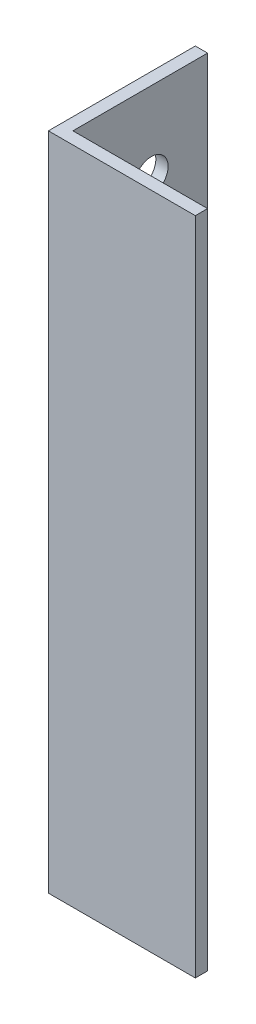
ISO-10303-21;
HEADER;
FILE_DESCRIPTION(('STEP AP214'),'2;1');
FILE_NAME('part.step','',(''),(''),'','','');
FILE_SCHEMA(('AUTOMOTIVE_DESIGN { 1 0 10303 214 1 1 1 1 }'));
ENDSEC;
DATA;
#1=APPLICATION_CONTEXT('core data for automotive mechanical design processes');
#2=APPLICATION_PROTOCOL_DEFINITION('international standard','automotive_design',2000,#1);
#3=PRODUCT_CONTEXT('',#1,'mechanical');
#4=PRODUCT('Part','Part','',(#3));
#5=PRODUCT_RELATED_PRODUCT_CATEGORY('part','',(#4));
#6=PRODUCT_DEFINITION_FORMATION('','',#4);
#7=PRODUCT_DEFINITION_CONTEXT('part definition',#1,'design');
#8=PRODUCT_DEFINITION('design','',#6,#7);
#9=PRODUCT_DEFINITION_SHAPE('','',#8);
#10=(LENGTH_UNIT() NAMED_UNIT(*) SI_UNIT(.MILLI.,.METRE.));
#11=(NAMED_UNIT(*) PLANE_ANGLE_UNIT() SI_UNIT($,.RADIAN.));
#12=(NAMED_UNIT(*) SI_UNIT($,.STERADIAN.) SOLID_ANGLE_UNIT());
#13=UNCERTAINTY_MEASURE_WITH_UNIT(LENGTH_MEASURE(1.E-05),#10,'distance_accuracy_value','');
#14=(GEOMETRIC_REPRESENTATION_CONTEXT(3) GLOBAL_UNCERTAINTY_ASSIGNED_CONTEXT((#13)) GLOBAL_UNIT_ASSIGNED_CONTEXT((#10,
#11,#12)) REPRESENTATION_CONTEXT('',''));
#15=CARTESIAN_POINT('',(0.,0.,0.));
#16=DIRECTION('',(0.,0.,1.));
#17=DIRECTION('',(1.,0.,0.));
#18=AXIS2_PLACEMENT_3D('',#15,#16,#17);
#19=CARTESIAN_POINT('',(0.,85.598,0.));
#20=DIRECTION('',(0.,0.,-1.));
#21=DIRECTION('',(-1.,0.,0.));
#22=AXIS2_PLACEMENT_3D('',#19,#20,#21);
#23=PLANE('',#22);
#24=DIRECTION('',(1.,0.,0.));
#25=VECTOR('',#24,1.);
#26=CARTESIAN_POINT('',(0.,0.,0.));
#27=LINE('',#26,#25);
#28=CARTESIAN_POINT('',(0.,0.,0.));
#29=VERTEX_POINT('',#28);
#30=CARTESIAN_POINT('',(19.05,0.,0.));
#31=VERTEX_POINT('',#30);
#32=EDGE_CURVE('E117',#29,#31,#27,.T.);
#33=ORIENTED_EDGE('',*,*,#32,.T.);
#34=DIRECTION('',(0.,-1.,0.));
#35=VECTOR('',#34,1.);
#36=CARTESIAN_POINT('',(19.05,85.598,0.));
#37=LINE('',#36,#35);
#38=CARTESIAN_POINT('',(19.05,85.598,0.));
#39=VERTEX_POINT('',#38);
#40=EDGE_CURVE('E11',#39,#31,#37,.T.);
#41=ORIENTED_EDGE('',*,*,#40,.F.);
#42=DIRECTION('',(1.,0.,0.));
#43=VECTOR('',#42,1.);
#44=CARTESIAN_POINT('',(0.,85.598,0.));
#45=LINE('',#44,#43);
#46=CARTESIAN_POINT('',(0.,85.598,0.));
#47=VERTEX_POINT('',#46);
#48=EDGE_CURVE('E128',#47,#39,#45,.T.);
#49=ORIENTED_EDGE('',*,*,#48,.F.);
#50=DIRECTION('',(0.,-1.,0.));
#51=VECTOR('',#50,1.);
#52=CARTESIAN_POINT('',(0.,85.598,0.));
#53=LINE('',#52,#51);
#54=EDGE_CURVE('E113',#47,#29,#53,.T.);
#55=ORIENTED_EDGE('',*,*,#54,.T.);
#56=EDGE_LOOP('',(#33,#41,#49,#55));
#57=FACE_BOUND('',#56,.T.);
#58=ADVANCED_FACE('F33',(#57),#23,.F.);
#59=CARTESIAN_POINT('',(19.05,85.598,0.));
#60=DIRECTION('',(-1.,0.,0.));
#61=DIRECTION('',(0.,0.,1.));
#62=AXIS2_PLACEMENT_3D('',#59,#60,#61);
#63=PLANE('',#62);
#64=DIRECTION('',(0.,0.,-1.));
#65=VECTOR('',#64,1.);
#66=CARTESIAN_POINT('',(19.05,0.,0.));
#67=LINE('',#66,#65);
#68=CARTESIAN_POINT('',(19.05,0.,-1.5875));
#69=VERTEX_POINT('',#68);
#70=EDGE_CURVE('E120',#31,#69,#67,.T.);
#71=ORIENTED_EDGE('',*,*,#70,.T.);
#72=DIRECTION('',(0.,-1.,0.));
#73=VECTOR('',#72,1.);
#74=CARTESIAN_POINT('',(19.05,85.598,-1.5875));
#75=LINE('',#74,#73);
#76=CARTESIAN_POINT('',(19.05,85.598,-1.5875));
#77=VERTEX_POINT('',#76);
#78=EDGE_CURVE('E41',#77,#69,#75,.T.);
#79=ORIENTED_EDGE('',*,*,#78,.F.);
#80=DIRECTION('',(0.,0.,-1.));
#81=VECTOR('',#80,1.);
#82=CARTESIAN_POINT('',(19.05,85.598,0.));
#83=LINE('',#82,#81);
#84=EDGE_CURVE('E86',#39,#77,#83,.T.);
#85=ORIENTED_EDGE('',*,*,#84,.F.);
#86=ORIENTED_EDGE('',*,*,#40,.T.);
#87=EDGE_LOOP('',(#71,#79,#85,#86));
#88=FACE_BOUND('',#87,.T.);
#89=ADVANCED_FACE('F157',(#88),#63,.F.);
#90=CARTESIAN_POINT('',(19.05,85.598,-1.5875));
#91=DIRECTION('',(0.,0.,1.));
#92=DIRECTION('',(1.,0.,0.));
#93=AXIS2_PLACEMENT_3D('',#90,#91,#92);
#94=PLANE('',#93);
#95=DIRECTION('',(-1.,0.,0.));
#96=VECTOR('',#95,1.);
#97=CARTESIAN_POINT('',(19.05,0.,-1.5875));
#98=LINE('',#97,#96);
#99=CARTESIAN_POINT('',(1.5875,0.,-1.5875));
#100=VERTEX_POINT('',#99);
#101=EDGE_CURVE('E123',#69,#100,#98,.T.);
#102=ORIENTED_EDGE('',*,*,#101,.T.);
#103=DIRECTION('',(0.,-1.,0.));
#104=VECTOR('',#103,1.);
#105=CARTESIAN_POINT('',(1.5875,85.598,-1.5875));
#106=LINE('',#105,#104);
#107=CARTESIAN_POINT('',(1.5875,85.598,-1.5875));
#108=VERTEX_POINT('',#107);
#109=EDGE_CURVE('E108',#108,#100,#106,.T.);
#110=ORIENTED_EDGE('',*,*,#109,.F.);
#111=DIRECTION('',(-1.,0.,0.));
#112=VECTOR('',#111,1.);
#113=CARTESIAN_POINT('',(19.05,85.598,-1.5875));
#114=LINE('',#113,#112);
#115=EDGE_CURVE('E99',#77,#108,#114,.T.);
#116=ORIENTED_EDGE('',*,*,#115,.F.);
#117=ORIENTED_EDGE('',*,*,#78,.T.);
#118=EDGE_LOOP('',(#102,#110,#116,#117));
#119=FACE_BOUND('',#118,.T.);
#120=ADVANCED_FACE('F134',(#119),#94,.F.);
#121=CARTESIAN_POINT('',(1.5875,85.598,-1.5875));
#122=DIRECTION('',(-1.,0.,0.));
#123=DIRECTION('',(0.,0.,1.));
#124=AXIS2_PLACEMENT_3D('',#121,#122,#123);
#125=PLANE('',#124);
#126=CARTESIAN_POINT('',(1.5875,10.16,-11.7475));
#127=DIRECTION('',(-1.,0.,0.));
#128=DIRECTION('',(0.,0.,1.));
#129=AXIS2_PLACEMENT_3D('',#126,#127,#128);
#130=CIRCLE('',#129,2.1828125);
#131=CARTESIAN_POINT('',(1.5875,10.16,-9.5646875));
#132=VERTEX_POINT('',#131);
#133=EDGE_CURVE('E173',#132,#132,#130,.T.);
#134=ORIENTED_EDGE('',*,*,#133,.T.);
#135=EDGE_LOOP('',(#134));
#136=FACE_BOUND('',#135,.T.);
#137=CARTESIAN_POINT('',(1.5875,75.438,-11.7475));
#138=DIRECTION('',(-1.,0.,0.));
#139=DIRECTION('',(0.,0.,1.));
#140=AXIS2_PLACEMENT_3D('',#137,#138,#139);
#141=CIRCLE('',#140,2.1828125);
#142=CARTESIAN_POINT('',(1.5875,75.438,-9.5646875));
#143=VERTEX_POINT('',#142);
#144=EDGE_CURVE('E121',#143,#143,#141,.T.);
#145=ORIENTED_EDGE('',*,*,#144,.T.);
#146=EDGE_LOOP('',(#145));
#147=FACE_BOUND('',#146,.T.);
#148=DIRECTION('',(0.,0.,-1.));
#149=VECTOR('',#148,1.);
#150=CARTESIAN_POINT('',(1.5875,0.,-1.5875));
#151=LINE('',#150,#149);
#152=CARTESIAN_POINT('',(1.5875,0.,-19.05));
#153=VERTEX_POINT('',#152);
#154=EDGE_CURVE('E107',#100,#153,#151,.T.);
#155=ORIENTED_EDGE('',*,*,#154,.T.);
#156=DIRECTION('',(0.,-1.,0.));
#157=VECTOR('',#156,1.);
#158=CARTESIAN_POINT('',(1.5875,85.598,-19.05));
#159=LINE('',#158,#157);
#160=CARTESIAN_POINT('',(1.5875,85.598,-19.05));
#161=VERTEX_POINT('',#160);
#162=EDGE_CURVE('E104',#161,#153,#159,.T.);
#163=ORIENTED_EDGE('',*,*,#162,.F.);
#164=DIRECTION('',(0.,0.,-1.));
#165=VECTOR('',#164,1.);
#166=CARTESIAN_POINT('',(1.5875,85.598,-1.5875));
#167=LINE('',#166,#165);
#168=EDGE_CURVE('E93',#108,#161,#167,.T.);
#169=ORIENTED_EDGE('',*,*,#168,.F.);
#170=ORIENTED_EDGE('',*,*,#109,.T.);
#171=EDGE_LOOP('',(#155,#163,#169,#170));
#172=FACE_BOUND('',#171,.T.);
#173=ADVANCED_FACE('F105',(#136,#147,#172),#125,.F.);
#174=CARTESIAN_POINT('',(1.5875,85.598,-19.05));
#175=DIRECTION('',(0.,0.,1.));
#176=DIRECTION('',(1.,0.,0.));
#177=AXIS2_PLACEMENT_3D('',#174,#175,#176);
#178=PLANE('',#177);
#179=DIRECTION('',(-1.,0.,0.));
#180=VECTOR('',#179,1.);
#181=CARTESIAN_POINT('',(1.5875,0.,-19.05));
#182=LINE('',#181,#180);
#183=CARTESIAN_POINT('',(0.,0.,-19.05));
#184=VERTEX_POINT('',#183);
#185=EDGE_CURVE('E72',#153,#184,#182,.T.);
#186=ORIENTED_EDGE('',*,*,#185,.T.);
#187=DIRECTION('',(0.,-1.,0.));
#188=VECTOR('',#187,1.);
#189=CARTESIAN_POINT('',(0.,85.598,-19.05));
#190=LINE('',#189,#188);
#191=CARTESIAN_POINT('',(0.,85.598,-19.05));
#192=VERTEX_POINT('',#191);
#193=EDGE_CURVE('E109',#192,#184,#190,.T.);
#194=ORIENTED_EDGE('',*,*,#193,.F.);
#195=DIRECTION('',(-1.,0.,0.));
#196=VECTOR('',#195,1.);
#197=CARTESIAN_POINT('',(1.5875,85.598,-19.05));
#198=LINE('',#197,#196);
#199=EDGE_CURVE('E97',#161,#192,#198,.T.);
#200=ORIENTED_EDGE('',*,*,#199,.F.);
#201=ORIENTED_EDGE('',*,*,#162,.T.);
#202=EDGE_LOOP('',(#186,#194,#200,#201));
#203=FACE_BOUND('',#202,.T.);
#204=ADVANCED_FACE('F111',(#203),#178,.F.);
#205=CARTESIAN_POINT('',(0.,85.598,0.));
#206=DIRECTION('',(1.,0.,0.));
#207=DIRECTION('',(0.,0.,-1.));
#208=AXIS2_PLACEMENT_3D('',#205,#206,#207);
#209=PLANE('',#208);
#210=CARTESIAN_POINT('',(0.,10.16,-11.7475));
#211=DIRECTION('',(-1.,0.,0.));
#212=DIRECTION('',(0.,0.,1.));
#213=AXIS2_PLACEMENT_3D('',#210,#211,#212);
#214=CIRCLE('',#213,2.1828125);
#215=CARTESIAN_POINT('',(0.,10.16,-9.5646875));
#216=VERTEX_POINT('',#215);
#217=EDGE_CURVE('E185',#216,#216,#214,.T.);
#218=ORIENTED_EDGE('',*,*,#217,.F.);
#219=EDGE_LOOP('',(#218));
#220=FACE_BOUND('',#219,.T.);
#221=CARTESIAN_POINT('',(0.,75.438,-11.7475));
#222=DIRECTION('',(-1.,0.,0.));
#223=DIRECTION('',(0.,0.,1.));
#224=AXIS2_PLACEMENT_3D('',#221,#222,#223);
#225=CIRCLE('',#224,2.1828125);
#226=CARTESIAN_POINT('',(0.,75.438,-9.5646875));
#227=VERTEX_POINT('',#226);
#228=EDGE_CURVE('E177',#227,#227,#225,.T.);
#229=ORIENTED_EDGE('',*,*,#228,.F.);
#230=EDGE_LOOP('',(#229));
#231=FACE_BOUND('',#230,.T.);
#232=DIRECTION('',(0.,0.,1.));
#233=VECTOR('',#232,1.);
#234=CARTESIAN_POINT('',(0.,0.,0.));
#235=LINE('',#234,#233);
#236=EDGE_CURVE('E78',#184,#29,#235,.T.);
#237=ORIENTED_EDGE('',*,*,#236,.T.);
#238=ORIENTED_EDGE('',*,*,#54,.F.);
#239=DIRECTION('',(0.,0.,1.));
#240=VECTOR('',#239,1.);
#241=CARTESIAN_POINT('',(0.,85.598,0.));
#242=LINE('',#241,#240);
#243=EDGE_CURVE('E49',#192,#47,#242,.T.);
#244=ORIENTED_EDGE('',*,*,#243,.F.);
#245=ORIENTED_EDGE('',*,*,#193,.T.);
#246=EDGE_LOOP('',(#237,#238,#244,#245));
#247=FACE_BOUND('',#246,.T.);
#248=ADVANCED_FACE('F141',(#220,#231,#247),#209,.F.);
#249=CARTESIAN_POINT('',(0.,85.598,0.));
#250=DIRECTION('',(0.,1.,0.));
#251=DIRECTION('',(0.,0.,1.));
#252=AXIS2_PLACEMENT_3D('',#249,#250,#251);
#253=PLANE('',#252);
#254=ORIENTED_EDGE('',*,*,#48,.T.);
#255=ORIENTED_EDGE('',*,*,#84,.T.);
#256=ORIENTED_EDGE('',*,*,#115,.T.);
#257=ORIENTED_EDGE('',*,*,#168,.T.);
#258=ORIENTED_EDGE('',*,*,#199,.T.);
#259=ORIENTED_EDGE('',*,*,#243,.T.);
#260=EDGE_LOOP('',(#254,#255,#256,#257,#258,#259));
#261=FACE_BOUND('',#260,.T.);
#262=ADVANCED_FACE('F95',(#261),#253,.T.);
#263=CARTESIAN_POINT('',(0.,0.,0.));
#264=DIRECTION('',(0.,1.,0.));
#265=DIRECTION('',(0.,0.,1.));
#266=AXIS2_PLACEMENT_3D('',#263,#264,#265);
#267=PLANE('',#266);
#268=ORIENTED_EDGE('',*,*,#32,.F.);
#269=ORIENTED_EDGE('',*,*,#236,.F.);
#270=ORIENTED_EDGE('',*,*,#185,.F.);
#271=ORIENTED_EDGE('',*,*,#154,.F.);
#272=ORIENTED_EDGE('',*,*,#101,.F.);
#273=ORIENTED_EDGE('',*,*,#70,.F.);
#274=EDGE_LOOP('',(#268,#269,#270,#271,#272,#273));
#275=FACE_BOUND('',#274,.T.);
#276=ADVANCED_FACE('F137',(#275),#267,.F.);
#277=CARTESIAN_POINT('',(19.05,75.438,-11.7475));
#278=DIRECTION('',(-1.,0.,0.));
#279=DIRECTION('',(0.,0.,1.));
#280=AXIS2_PLACEMENT_3D('',#277,#278,#279);
#281=CYLINDRICAL_SURFACE('',#280,2.1828125);
#282=CARTESIAN_POINT('',(0.,75.438,-9.5646875));
#283=CARTESIAN_POINT('',(0.016536458333333,75.438,-9.5646875));
#284=CARTESIAN_POINT('',(0.0330729166666659,75.438,-9.5646875));
#285=CARTESIAN_POINT('',(0.066145833333333,75.438,-9.5646875));
#286=CARTESIAN_POINT('',(0.0826822916666671,75.438,-9.5646875));
#287=CARTESIAN_POINT('',(0.115755208333334,75.438,-9.5646875));
#288=CARTESIAN_POINT('',(0.132291666666667,75.438,-9.5646875));
#289=CARTESIAN_POINT('',(0.165364583333333,75.438,-9.5646875));
#290=CARTESIAN_POINT('',(0.181901041666666,75.438,-9.5646875));
#291=CARTESIAN_POINT('',(0.214973958333333,75.438,-9.5646875));
#292=CARTESIAN_POINT('',(0.231510416666667,75.438,-9.5646875));
#293=CARTESIAN_POINT('',(0.264583333333334,75.438,-9.5646875));
#294=CARTESIAN_POINT('',(0.281119791666667,75.438,-9.5646875));
#295=CARTESIAN_POINT('',(0.314192708333333,75.438,-9.5646875));
#296=CARTESIAN_POINT('',(0.330729166666666,75.438,-9.5646875));
#297=CARTESIAN_POINT('',(0.363802083333332,75.438,-9.5646875));
#298=CARTESIAN_POINT('',(0.380338541666665,75.438,-9.5646875));
#299=CARTESIAN_POINT('',(0.413411458333332,75.438,-9.5646875));
#300=CARTESIAN_POINT('',(0.429947916666666,75.438,-9.5646875));
#301=CARTESIAN_POINT('',(0.463020833333333,75.438,-9.5646875));
#302=CARTESIAN_POINT('',(0.479557291666666,75.438,-9.5646875));
#303=CARTESIAN_POINT('',(0.512630208333332,75.438,-9.5646875));
#304=CARTESIAN_POINT('',(0.529166666666665,75.438,-9.5646875));
#305=CARTESIAN_POINT('',(0.562239583333332,75.438,-9.5646875));
#306=CARTESIAN_POINT('',(0.578776041666666,75.438,-9.5646875));
#307=CARTESIAN_POINT('',(0.611848958333333,75.438,-9.5646875));
#308=CARTESIAN_POINT('',(0.628385416666666,75.438,-9.5646875));
#309=CARTESIAN_POINT('',(0.661458333333332,75.438,-9.5646875));
#310=CARTESIAN_POINT('',(0.677994791666665,75.438,-9.5646875));
#311=CARTESIAN_POINT('',(0.711067708333332,75.438,-9.5646875));
#312=CARTESIAN_POINT('',(0.727604166666666,75.438,-9.5646875));
#313=CARTESIAN_POINT('',(0.760677083333333,75.438,-9.5646875));
#314=CARTESIAN_POINT('',(0.777213541666666,75.438,-9.5646875));
#315=CARTESIAN_POINT('',(0.810286458333332,75.438,-9.5646875));
#316=CARTESIAN_POINT('',(0.826822916666665,75.438,-9.5646875));
#317=CARTESIAN_POINT('',(0.859895833333332,75.438,-9.5646875));
#318=CARTESIAN_POINT('',(0.876432291666666,75.438,-9.5646875));
#319=CARTESIAN_POINT('',(0.909505208333333,75.438,-9.5646875));
#320=CARTESIAN_POINT('',(0.926041666666666,75.438,-9.5646875));
#321=CARTESIAN_POINT('',(0.959114583333332,75.438,-9.5646875));
#322=CARTESIAN_POINT('',(0.975651041666665,75.438,-9.5646875));
#323=CARTESIAN_POINT('',(1.00872395833333,75.438,-9.5646875));
#324=CARTESIAN_POINT('',(1.02526041666667,75.438,-9.5646875));
#325=CARTESIAN_POINT('',(1.05833333333333,75.438,-9.5646875));
#326=CARTESIAN_POINT('',(1.07486979166667,75.438,-9.5646875));
#327=CARTESIAN_POINT('',(1.10794270833333,75.438,-9.5646875));
#328=CARTESIAN_POINT('',(1.12447916666667,75.438,-9.5646875));
#329=CARTESIAN_POINT('',(1.15755208333333,75.438,-9.5646875));
#330=CARTESIAN_POINT('',(1.17408854166667,75.438,-9.5646875));
#331=CARTESIAN_POINT('',(1.20716145833333,75.438,-9.5646875));
#332=CARTESIAN_POINT('',(1.22369791666667,75.438,-9.5646875));
#333=CARTESIAN_POINT('',(1.25677083333333,75.438,-9.5646875));
#334=CARTESIAN_POINT('',(1.27330729166667,75.438,-9.5646875));
#335=CARTESIAN_POINT('',(1.30638020833333,75.438,-9.5646875));
#336=CARTESIAN_POINT('',(1.32291666666666,75.438,-9.5646875));
#337=CARTESIAN_POINT('',(1.35598958333333,75.438,-9.5646875));
#338=CARTESIAN_POINT('',(1.37252604166667,75.438,-9.5646875));
#339=CARTESIAN_POINT('',(1.40559895833333,75.438,-9.5646875));
#340=CARTESIAN_POINT('',(1.42213541666667,75.438,-9.5646875));
#341=CARTESIAN_POINT('',(1.45520833333333,75.438,-9.5646875));
#342=CARTESIAN_POINT('',(1.47174479166666,75.438,-9.5646875));
#343=CARTESIAN_POINT('',(1.50481770833333,75.438,-9.5646875));
#344=CARTESIAN_POINT('',(1.52135416666667,75.438,-9.5646875));
#345=CARTESIAN_POINT('',(1.55442708333333,75.438,-9.5646875));
#346=CARTESIAN_POINT('',(1.57096354166667,75.438,-9.5646875));
#347=CARTESIAN_POINT('',(1.5875,75.438,-9.5646875));
#348=B_SPLINE_CURVE_WITH_KNOTS('',3,(#282,#283,#284,#285,#286,#287,#288,#289,#290,#291,#292,
#293,#294,#295,#296,#297,#298,#299,#300,#301,#302,#303,#304,#305,#306,#307,#308,#309,#310,#311,
#312,#313,#314,#315,#316,#317,#318,#319,#320,#321,#322,#323,#324,#325,#326,#327,#328,#329,#330,
#331,#332,#333,#334,#335,#336,#337,#338,#339,#340,#341,#342,#343,#344,#345,#346,#347),
.UNSPECIFIED.,.F.,.F.,(4,2,2,2,2,2,2,2,2,2,2,2,2,2,2,2,2,2,2,2,2,2,2,2,2,2,2,2,2,2,2,2,4),(0.,
0.0496093749999989,0.0992187500000012,0.148828125,0.198437499999999,0.248046875000001,
0.29765625,0.347265624999999,0.396874999999998,0.446484375,0.496093749999999,0.545703124999998,
0.5953125,0.644921874999999,0.694531249999998,0.744140625,0.793749999999999,0.843359374999998,
0.892968750000001,0.942578124999999,0.992187499999998,1.041796875,1.09140625,1.141015625,
1.190625,1.240234375,1.28984375,1.339453125,1.3890625,1.438671875,1.48828125,1.537890625,
1.5875),.UNSPECIFIED.);
#349=EDGE_CURVE('BSEAM191',#227,#143,#348,.T.);
#350=ORIENTED_EDGE('',*,*,#228,.T.);
#351=ORIENTED_EDGE('',*,*,#144,.F.);
#352=ORIENTED_EDGE('',*,*,#349,.T.);
#353=ORIENTED_EDGE('',*,*,#349,.F.);
#354=EDGE_LOOP('',(#350,#352,#351,#353));
#355=FACE_BOUND('',#354,.T.);
#356=ADVANCED_FACE('F191',(#355),#281,.F.);
#357=CARTESIAN_POINT('',(19.05,10.16,-11.7475));
#358=DIRECTION('',(-1.,0.,0.));
#359=DIRECTION('',(0.,0.,1.));
#360=AXIS2_PLACEMENT_3D('',#357,#358,#359);
#361=CYLINDRICAL_SURFACE('',#360,2.1828125);
#362=CARTESIAN_POINT('',(0.,10.16,-9.5646875));
#363=CARTESIAN_POINT('',(0.016536458333333,10.16,-9.5646875));
#364=CARTESIAN_POINT('',(0.0330729166666659,10.16,-9.5646875));
#365=CARTESIAN_POINT('',(0.066145833333333,10.16,-9.5646875));
#366=CARTESIAN_POINT('',(0.0826822916666671,10.16,-9.5646875));
#367=CARTESIAN_POINT('',(0.115755208333334,10.16,-9.5646875));
#368=CARTESIAN_POINT('',(0.132291666666667,10.16,-9.5646875));
#369=CARTESIAN_POINT('',(0.165364583333333,10.16,-9.5646875));
#370=CARTESIAN_POINT('',(0.181901041666666,10.16,-9.5646875));
#371=CARTESIAN_POINT('',(0.214973958333333,10.16,-9.5646875));
#372=CARTESIAN_POINT('',(0.231510416666667,10.16,-9.5646875));
#373=CARTESIAN_POINT('',(0.264583333333334,10.16,-9.5646875));
#374=CARTESIAN_POINT('',(0.281119791666667,10.16,-9.5646875));
#375=CARTESIAN_POINT('',(0.314192708333333,10.16,-9.5646875));
#376=CARTESIAN_POINT('',(0.330729166666666,10.16,-9.5646875));
#377=CARTESIAN_POINT('',(0.363802083333332,10.16,-9.5646875));
#378=CARTESIAN_POINT('',(0.380338541666665,10.16,-9.5646875));
#379=CARTESIAN_POINT('',(0.413411458333332,10.16,-9.5646875));
#380=CARTESIAN_POINT('',(0.429947916666666,10.16,-9.5646875));
#381=CARTESIAN_POINT('',(0.463020833333333,10.16,-9.5646875));
#382=CARTESIAN_POINT('',(0.479557291666666,10.16,-9.5646875));
#383=CARTESIAN_POINT('',(0.512630208333332,10.16,-9.5646875));
#384=CARTESIAN_POINT('',(0.529166666666665,10.16,-9.5646875));
#385=CARTESIAN_POINT('',(0.562239583333332,10.16,-9.5646875));
#386=CARTESIAN_POINT('',(0.578776041666666,10.16,-9.5646875));
#387=CARTESIAN_POINT('',(0.611848958333333,10.16,-9.5646875));
#388=CARTESIAN_POINT('',(0.628385416666666,10.16,-9.5646875));
#389=CARTESIAN_POINT('',(0.661458333333332,10.16,-9.5646875));
#390=CARTESIAN_POINT('',(0.677994791666665,10.16,-9.5646875));
#391=CARTESIAN_POINT('',(0.711067708333332,10.16,-9.5646875));
#392=CARTESIAN_POINT('',(0.727604166666666,10.16,-9.5646875));
#393=CARTESIAN_POINT('',(0.760677083333333,10.16,-9.5646875));
#394=CARTESIAN_POINT('',(0.777213541666666,10.16,-9.5646875));
#395=CARTESIAN_POINT('',(0.810286458333332,10.16,-9.5646875));
#396=CARTESIAN_POINT('',(0.826822916666665,10.16,-9.5646875));
#397=CARTESIAN_POINT('',(0.859895833333332,10.16,-9.5646875));
#398=CARTESIAN_POINT('',(0.876432291666666,10.16,-9.5646875));
#399=CARTESIAN_POINT('',(0.909505208333333,10.16,-9.5646875));
#400=CARTESIAN_POINT('',(0.926041666666666,10.16,-9.5646875));
#401=CARTESIAN_POINT('',(0.959114583333332,10.16,-9.5646875));
#402=CARTESIAN_POINT('',(0.975651041666665,10.16,-9.5646875));
#403=CARTESIAN_POINT('',(1.00872395833333,10.16,-9.5646875));
#404=CARTESIAN_POINT('',(1.02526041666667,10.16,-9.5646875));
#405=CARTESIAN_POINT('',(1.05833333333333,10.16,-9.5646875));
#406=CARTESIAN_POINT('',(1.07486979166667,10.16,-9.5646875));
#407=CARTESIAN_POINT('',(1.10794270833333,10.16,-9.5646875));
#408=CARTESIAN_POINT('',(1.12447916666667,10.16,-9.5646875));
#409=CARTESIAN_POINT('',(1.15755208333333,10.16,-9.5646875));
#410=CARTESIAN_POINT('',(1.17408854166667,10.16,-9.5646875));
#411=CARTESIAN_POINT('',(1.20716145833333,10.16,-9.5646875));
#412=CARTESIAN_POINT('',(1.22369791666667,10.16,-9.5646875));
#413=CARTESIAN_POINT('',(1.25677083333333,10.16,-9.5646875));
#414=CARTESIAN_POINT('',(1.27330729166667,10.16,-9.5646875));
#415=CARTESIAN_POINT('',(1.30638020833333,10.16,-9.5646875));
#416=CARTESIAN_POINT('',(1.32291666666666,10.16,-9.5646875));
#417=CARTESIAN_POINT('',(1.35598958333333,10.16,-9.5646875));
#418=CARTESIAN_POINT('',(1.37252604166667,10.16,-9.5646875));
#419=CARTESIAN_POINT('',(1.40559895833333,10.16,-9.5646875));
#420=CARTESIAN_POINT('',(1.42213541666667,10.16,-9.5646875));
#421=CARTESIAN_POINT('',(1.45520833333333,10.16,-9.5646875));
#422=CARTESIAN_POINT('',(1.47174479166666,10.16,-9.5646875));
#423=CARTESIAN_POINT('',(1.50481770833333,10.16,-9.5646875));
#424=CARTESIAN_POINT('',(1.52135416666667,10.16,-9.5646875));
#425=CARTESIAN_POINT('',(1.55442708333333,10.16,-9.5646875));
#426=CARTESIAN_POINT('',(1.57096354166667,10.16,-9.5646875));
#427=CARTESIAN_POINT('',(1.5875,10.16,-9.5646875));
#428=B_SPLINE_CURVE_WITH_KNOTS('',3,(#362,#363,#364,#365,#366,#367,#368,#369,#370,#371,#372,
#373,#374,#375,#376,#377,#378,#379,#380,#381,#382,#383,#384,#385,#386,#387,#388,#389,#390,#391,
#392,#393,#394,#395,#396,#397,#398,#399,#400,#401,#402,#403,#404,#405,#406,#407,#408,#409,#410,
#411,#412,#413,#414,#415,#416,#417,#418,#419,#420,#421,#422,#423,#424,#425,#426,#427),
.UNSPECIFIED.,.F.,.F.,(4,2,2,2,2,2,2,2,2,2,2,2,2,2,2,2,2,2,2,2,2,2,2,2,2,2,2,2,2,2,2,2,4),(0.,
0.0496093749999989,0.0992187500000012,0.148828125,0.198437499999999,0.248046875000001,
0.29765625,0.347265624999999,0.396874999999998,0.446484375,0.496093749999999,0.545703124999998,
0.5953125,0.644921874999999,0.694531249999998,0.744140625,0.793749999999999,0.843359374999998,
0.892968750000001,0.942578124999999,0.992187499999998,1.041796875,1.09140625,1.141015625,
1.190625,1.240234375,1.28984375,1.339453125,1.3890625,1.438671875,1.48828125,1.537890625,
1.5875),.UNSPECIFIED.);
#429=EDGE_CURVE('BSEAM188',#216,#132,#428,.T.);
#430=ORIENTED_EDGE('',*,*,#217,.T.);
#431=ORIENTED_EDGE('',*,*,#133,.F.);
#432=ORIENTED_EDGE('',*,*,#429,.T.);
#433=ORIENTED_EDGE('',*,*,#429,.F.);
#434=EDGE_LOOP('',(#430,#432,#431,#433));
#435=FACE_BOUND('',#434,.T.);
#436=ADVANCED_FACE('F188',(#435),#361,.F.);
#437=CLOSED_SHELL('',(#58,#89,#120,#173,#204,#248,#262,#276,#356,#436));
#438=MANIFOLD_SOLID_BREP('B2',#437);
#439=ADVANCED_BREP_SHAPE_REPRESENTATION('',(#18,#438),#14);
#440=SHAPE_DEFINITION_REPRESENTATION(#9,#439);
ENDSEC;
END-ISO-10303-21;
